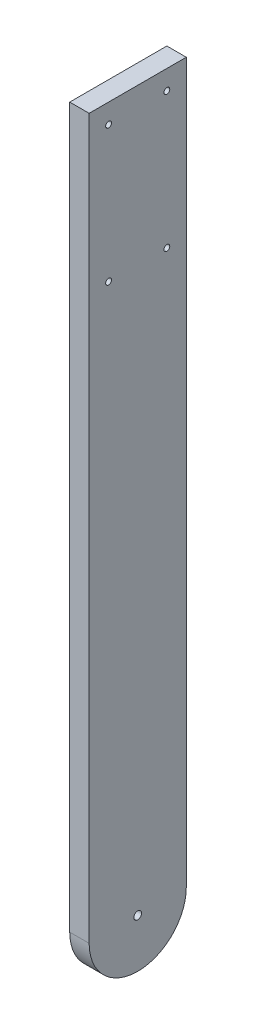
ISO-10303-21;
HEADER;
FILE_DESCRIPTION(('STEP AP214'),'2;1');
FILE_NAME('part.step','',(''),(''),'','','');
FILE_SCHEMA(('AUTOMOTIVE_DESIGN { 1 0 10303 214 1 1 1 1 }'));
ENDSEC;
DATA;
#1=APPLICATION_CONTEXT('core data for automotive mechanical design processes');
#2=APPLICATION_PROTOCOL_DEFINITION('international standard','automotive_design',2000,#1);
#3=PRODUCT_CONTEXT('',#1,'mechanical');
#4=PRODUCT('Part','Part','',(#3));
#5=PRODUCT_RELATED_PRODUCT_CATEGORY('part','',(#4));
#6=PRODUCT_DEFINITION_FORMATION('','',#4);
#7=PRODUCT_DEFINITION_CONTEXT('part definition',#1,'design');
#8=PRODUCT_DEFINITION('design','',#6,#7);
#9=PRODUCT_DEFINITION_SHAPE('','',#8);
#10=(LENGTH_UNIT() NAMED_UNIT(*) SI_UNIT(.MILLI.,.METRE.));
#11=(NAMED_UNIT(*) PLANE_ANGLE_UNIT() SI_UNIT($,.RADIAN.));
#12=(NAMED_UNIT(*) SI_UNIT($,.STERADIAN.) SOLID_ANGLE_UNIT());
#13=UNCERTAINTY_MEASURE_WITH_UNIT(LENGTH_MEASURE(1.E-05),#10,'distance_accuracy_value','');
#14=(GEOMETRIC_REPRESENTATION_CONTEXT(3) GLOBAL_UNCERTAINTY_ASSIGNED_CONTEXT((#13)) GLOBAL_UNIT_ASSIGNED_CONTEXT((#10,
#11,#12)) REPRESENTATION_CONTEXT('',''));
#15=CARTESIAN_POINT('',(0.,0.,0.));
#16=DIRECTION('',(0.,0.,1.));
#17=DIRECTION('',(1.,0.,0.));
#18=AXIS2_PLACEMENT_3D('',#15,#16,#17);
#19=CARTESIAN_POINT('',(5.,100.,-12.5));
#20=DIRECTION('',(0.,0.,1.));
#21=DIRECTION('',(0.,-1.,0.));
#22=AXIS2_PLACEMENT_3D('',#19,#20,#21);
#23=PLANE('',#22);
#24=DIRECTION('',(0.,1.,0.));
#25=VECTOR('',#24,1.);
#26=CARTESIAN_POINT('',(0.,100.,-12.5));
#27=LINE('',#26,#25);
#28=CARTESIAN_POINT('',(0.,-85.,-12.5));
#29=VERTEX_POINT('',#28);
#30=CARTESIAN_POINT('',(0.,100.,-12.5));
#31=VERTEX_POINT('',#30);
#32=EDGE_CURVE('E96',#29,#31,#27,.T.);
#33=ORIENTED_EDGE('',*,*,#32,.T.);
#34=DIRECTION('',(-1.,0.,0.));
#35=VECTOR('',#34,1.);
#36=CARTESIAN_POINT('',(5.,100.,-12.5));
#37=LINE('',#36,#35);
#38=CARTESIAN_POINT('',(5.,100.,-12.5));
#39=VERTEX_POINT('',#38);
#40=EDGE_CURVE('E11',#39,#31,#37,.T.);
#41=ORIENTED_EDGE('',*,*,#40,.F.);
#42=DIRECTION('',(0.,1.,0.));
#43=VECTOR('',#42,1.);
#44=CARTESIAN_POINT('',(5.,100.,-12.5));
#45=LINE('',#44,#43);
#46=CARTESIAN_POINT('',(5.,-85.,-12.5));
#47=VERTEX_POINT('',#46);
#48=EDGE_CURVE('E84',#47,#39,#45,.T.);
#49=ORIENTED_EDGE('',*,*,#48,.F.);
#50=DIRECTION('',(-1.,0.,0.));
#51=VECTOR('',#50,1.);
#52=CARTESIAN_POINT('',(5.,-85.,-12.5));
#53=LINE('',#52,#51);
#54=EDGE_CURVE('E92',#47,#29,#53,.T.);
#55=ORIENTED_EDGE('',*,*,#54,.T.);
#56=EDGE_LOOP('',(#33,#41,#49,#55));
#57=FACE_BOUND('',#56,.T.);
#58=ADVANCED_FACE('F33',(#57),#23,.F.);
#59=CARTESIAN_POINT('',(5.,100.,-12.5));
#60=DIRECTION('',(0.,-1.,0.));
#61=DIRECTION('',(0.,0.,-1.));
#62=AXIS2_PLACEMENT_3D('',#59,#60,#61);
#63=PLANE('',#62);
#64=DIRECTION('',(0.,0.,1.));
#65=VECTOR('',#64,1.);
#66=CARTESIAN_POINT('',(0.,100.,-12.5));
#67=LINE('',#66,#65);
#68=CARTESIAN_POINT('',(0.,100.,12.5));
#69=VERTEX_POINT('',#68);
#70=EDGE_CURVE('E88',#31,#69,#67,.T.);
#71=ORIENTED_EDGE('',*,*,#70,.T.);
#72=DIRECTION('',(-1.,0.,0.));
#73=VECTOR('',#72,1.);
#74=CARTESIAN_POINT('',(5.,100.,12.5));
#75=LINE('',#74,#73);
#76=CARTESIAN_POINT('',(5.,100.,12.5));
#77=VERTEX_POINT('',#76);
#78=EDGE_CURVE('E41',#77,#69,#75,.T.);
#79=ORIENTED_EDGE('',*,*,#78,.F.);
#80=DIRECTION('',(0.,0.,1.));
#81=VECTOR('',#80,1.);
#82=CARTESIAN_POINT('',(5.,100.,-12.5));
#83=LINE('',#82,#81);
#84=EDGE_CURVE('E79',#39,#77,#83,.T.);
#85=ORIENTED_EDGE('',*,*,#84,.F.);
#86=ORIENTED_EDGE('',*,*,#40,.T.);
#87=EDGE_LOOP('',(#71,#79,#85,#86));
#88=FACE_BOUND('',#87,.T.);
#89=ADVANCED_FACE('F87',(#88),#63,.F.);
#90=CARTESIAN_POINT('',(5.,100.,12.5));
#91=DIRECTION('',(0.,0.,-1.));
#92=DIRECTION('',(0.,1.,0.));
#93=AXIS2_PLACEMENT_3D('',#90,#91,#92);
#94=PLANE('',#93);
#95=DIRECTION('',(0.,-1.,0.));
#96=VECTOR('',#95,1.);
#97=CARTESIAN_POINT('',(0.,100.,12.5));
#98=LINE('',#97,#96);
#99=CARTESIAN_POINT('',(0.,-85.,12.5));
#100=VERTEX_POINT('',#99);
#101=EDGE_CURVE('E66',#69,#100,#98,.T.);
#102=ORIENTED_EDGE('',*,*,#101,.T.);
#103=DIRECTION('',(-1.,0.,0.));
#104=VECTOR('',#103,1.);
#105=CARTESIAN_POINT('',(5.,-85.,12.5));
#106=LINE('',#105,#104);
#107=CARTESIAN_POINT('',(5.,-85.,12.5));
#108=VERTEX_POINT('',#107);
#109=EDGE_CURVE('E89',#108,#100,#106,.T.);
#110=ORIENTED_EDGE('',*,*,#109,.F.);
#111=DIRECTION('',(0.,-1.,0.));
#112=VECTOR('',#111,1.);
#113=CARTESIAN_POINT('',(5.,100.,12.5));
#114=LINE('',#113,#112);
#115=EDGE_CURVE('E82',#77,#108,#114,.T.);
#116=ORIENTED_EDGE('',*,*,#115,.F.);
#117=ORIENTED_EDGE('',*,*,#78,.T.);
#118=EDGE_LOOP('',(#102,#110,#116,#117));
#119=FACE_BOUND('',#118,.T.);
#120=ADVANCED_FACE('F90',(#119),#94,.F.);
#121=CARTESIAN_POINT('',(5.,-85.,0.));
#122=DIRECTION('',(-1.,0.,0.));
#123=DIRECTION('',(0.,0.,1.));
#124=AXIS2_PLACEMENT_3D('',#121,#122,#123);
#125=CYLINDRICAL_SURFACE('',#124,12.5);
#126=CARTESIAN_POINT('',(0.,-85.,0.));
#127=DIRECTION('',(1.,0.,0.));
#128=DIRECTION('',(0.,0.,-1.));
#129=AXIS2_PLACEMENT_3D('',#126,#127,#128);
#130=CIRCLE('',#129,12.5);
#131=EDGE_CURVE('E72',#100,#29,#130,.T.);
#132=ORIENTED_EDGE('',*,*,#131,.T.);
#133=ORIENTED_EDGE('',*,*,#54,.F.);
#134=CARTESIAN_POINT('',(5.,-85.,0.));
#135=DIRECTION('',(1.,0.,0.));
#136=DIRECTION('',(0.,0.,-1.));
#137=AXIS2_PLACEMENT_3D('',#134,#135,#136);
#138=CIRCLE('',#137,12.5);
#139=EDGE_CURVE('E49',#108,#47,#138,.T.);
#140=ORIENTED_EDGE('',*,*,#139,.F.);
#141=ORIENTED_EDGE('',*,*,#109,.T.);
#142=EDGE_LOOP('',(#132,#133,#140,#141));
#143=FACE_BOUND('',#142,.T.);
#144=ADVANCED_FACE('F104',(#143),#125,.T.);
#145=CARTESIAN_POINT('',(5.,-85.,0.));
#146=DIRECTION('',(1.,0.,0.));
#147=DIRECTION('',(0.,0.,-1.));
#148=AXIS2_PLACEMENT_3D('',#145,#146,#147);
#149=PLANE('',#148);
#150=CARTESIAN_POINT('',(5.,-85.,0.));
#151=DIRECTION('',(-1.,0.,0.));
#152=DIRECTION('',(0.,0.,1.));
#153=AXIS2_PLACEMENT_3D('',#150,#151,#152);
#154=CIRCLE('',#153,1.);
#155=CARTESIAN_POINT('',(5.,-85.,1.));
#156=VERTEX_POINT('',#155);
#157=EDGE_CURVE('E120',#156,#156,#154,.T.);
#158=ORIENTED_EDGE('',*,*,#157,.T.);
#159=EDGE_LOOP('',(#158));
#160=FACE_BOUND('',#159,.T.);
#161=CARTESIAN_POINT('',(5.,95.,7.5));
#162=DIRECTION('',(-1.,0.,0.));
#163=DIRECTION('',(0.,0.,-1.));
#164=AXIS2_PLACEMENT_3D('',#161,#162,#163);
#165=CIRCLE('',#164,0.75);
#166=CARTESIAN_POINT('',(5.,95.,6.75));
#167=VERTEX_POINT('',#166);
#168=EDGE_CURVE('E119',#167,#167,#165,.T.);
#169=ORIENTED_EDGE('',*,*,#168,.T.);
#170=EDGE_LOOP('',(#169));
#171=FACE_BOUND('',#170,.T.);
#172=CARTESIAN_POINT('',(5.,60.,7.5));
#173=DIRECTION('',(-1.,0.,0.));
#174=DIRECTION('',(0.,0.,1.));
#175=AXIS2_PLACEMENT_3D('',#172,#173,#174);
#176=CIRCLE('',#175,0.75);
#177=CARTESIAN_POINT('',(5.,60.,8.25));
#178=VERTEX_POINT('',#177);
#179=EDGE_CURVE('E126',#178,#178,#176,.T.);
#180=ORIENTED_EDGE('',*,*,#179,.T.);
#181=EDGE_LOOP('',(#180));
#182=FACE_BOUND('',#181,.T.);
#183=CARTESIAN_POINT('',(5.,60.,-7.5));
#184=DIRECTION('',(-1.,0.,0.));
#185=DIRECTION('',(0.,0.,-1.));
#186=AXIS2_PLACEMENT_3D('',#183,#184,#185);
#187=CIRCLE('',#186,0.75);
#188=CARTESIAN_POINT('',(5.,60.,-8.25));
#189=VERTEX_POINT('',#188);
#190=EDGE_CURVE('E113',#189,#189,#187,.T.);
#191=ORIENTED_EDGE('',*,*,#190,.T.);
#192=EDGE_LOOP('',(#191));
#193=FACE_BOUND('',#192,.T.);
#194=CARTESIAN_POINT('',(5.,95.,-7.5));
#195=DIRECTION('',(-1.,0.,0.));
#196=DIRECTION('',(0.,0.,1.));
#197=AXIS2_PLACEMENT_3D('',#194,#195,#196);
#198=CIRCLE('',#197,0.75);
#199=CARTESIAN_POINT('',(5.,95.,-6.75));
#200=VERTEX_POINT('',#199);
#201=EDGE_CURVE('E99',#200,#200,#198,.T.);
#202=ORIENTED_EDGE('',*,*,#201,.T.);
#203=EDGE_LOOP('',(#202));
#204=FACE_BOUND('',#203,.T.);
#205=ORIENTED_EDGE('',*,*,#48,.T.);
#206=ORIENTED_EDGE('',*,*,#84,.T.);
#207=ORIENTED_EDGE('',*,*,#115,.T.);
#208=ORIENTED_EDGE('',*,*,#139,.T.);
#209=EDGE_LOOP('',(#205,#206,#207,#208));
#210=FACE_BOUND('',#209,.T.);
#211=ADVANCED_FACE('F80',(#160,#171,#182,#193,#204,#210),#149,.T.);
#212=CARTESIAN_POINT('',(0.,-85.,0.));
#213=DIRECTION('',(1.,0.,0.));
#214=DIRECTION('',(0.,0.,-1.));
#215=AXIS2_PLACEMENT_3D('',#212,#213,#214);
#216=PLANE('',#215);
#217=CARTESIAN_POINT('',(0.,-85.,0.));
#218=DIRECTION('',(-1.,0.,0.));
#219=DIRECTION('',(0.,0.,1.));
#220=AXIS2_PLACEMENT_3D('',#217,#218,#219);
#221=CIRCLE('',#220,1.);
#222=CARTESIAN_POINT('',(0.,-85.,1.));
#223=VERTEX_POINT('',#222);
#224=EDGE_CURVE('E134',#223,#223,#221,.T.);
#225=ORIENTED_EDGE('',*,*,#224,.F.);
#226=EDGE_LOOP('',(#225));
#227=FACE_BOUND('',#226,.T.);
#228=CARTESIAN_POINT('',(0.,95.,7.5));
#229=DIRECTION('',(-1.,0.,0.));
#230=DIRECTION('',(0.,0.,-1.));
#231=AXIS2_PLACEMENT_3D('',#228,#229,#230);
#232=CIRCLE('',#231,0.75);
#233=CARTESIAN_POINT('',(0.,95.,6.75));
#234=VERTEX_POINT('',#233);
#235=EDGE_CURVE('E116',#234,#234,#232,.T.);
#236=ORIENTED_EDGE('',*,*,#235,.F.);
#237=EDGE_LOOP('',(#236));
#238=FACE_BOUND('',#237,.T.);
#239=CARTESIAN_POINT('',(0.,60.,7.5));
#240=DIRECTION('',(-1.,0.,0.));
#241=DIRECTION('',(0.,0.,1.));
#242=AXIS2_PLACEMENT_3D('',#239,#240,#241);
#243=CIRCLE('',#242,0.75);
#244=CARTESIAN_POINT('',(0.,60.,8.25));
#245=VERTEX_POINT('',#244);
#246=EDGE_CURVE('E123',#245,#245,#243,.T.);
#247=ORIENTED_EDGE('',*,*,#246,.F.);
#248=EDGE_LOOP('',(#247));
#249=FACE_BOUND('',#248,.T.);
#250=CARTESIAN_POINT('',(0.,60.,-7.5));
#251=DIRECTION('',(-1.,0.,0.));
#252=DIRECTION('',(0.,0.,-1.));
#253=AXIS2_PLACEMENT_3D('',#250,#251,#252);
#254=CIRCLE('',#253,0.75);
#255=CARTESIAN_POINT('',(0.,60.,-8.25));
#256=VERTEX_POINT('',#255);
#257=EDGE_CURVE('E129',#256,#256,#254,.T.);
#258=ORIENTED_EDGE('',*,*,#257,.F.);
#259=EDGE_LOOP('',(#258));
#260=FACE_BOUND('',#259,.T.);
#261=CARTESIAN_POINT('',(0.,95.,-7.5));
#262=DIRECTION('',(-1.,0.,0.));
#263=DIRECTION('',(0.,0.,1.));
#264=AXIS2_PLACEMENT_3D('',#261,#262,#263);
#265=CIRCLE('',#264,0.75);
#266=CARTESIAN_POINT('',(0.,95.,-6.75));
#267=VERTEX_POINT('',#266);
#268=EDGE_CURVE('E110',#267,#267,#265,.T.);
#269=ORIENTED_EDGE('',*,*,#268,.F.);
#270=EDGE_LOOP('',(#269));
#271=FACE_BOUND('',#270,.T.);
#272=ORIENTED_EDGE('',*,*,#32,.F.);
#273=ORIENTED_EDGE('',*,*,#131,.F.);
#274=ORIENTED_EDGE('',*,*,#101,.F.);
#275=ORIENTED_EDGE('',*,*,#70,.F.);
#276=EDGE_LOOP('',(#272,#273,#274,#275));
#277=FACE_BOUND('',#276,.T.);
#278=ADVANCED_FACE('F107',(#227,#238,#249,#260,#271,#277),#216,.F.);
#279=CARTESIAN_POINT('',(5.,95.,-7.5));
#280=DIRECTION('',(-1.,0.,0.));
#281=DIRECTION('',(0.,0.,1.));
#282=AXIS2_PLACEMENT_3D('',#279,#280,#281);
#283=CYLINDRICAL_SURFACE('',#282,0.75);
#284=ORIENTED_EDGE('',*,*,#201,.F.);
#285=EDGE_LOOP('',(#284));
#286=FACE_BOUND('',#285,.T.);
#287=ORIENTED_EDGE('',*,*,#268,.T.);
#288=EDGE_LOOP('',(#287));
#289=FACE_BOUND('',#288,.T.);
#290=ADVANCED_FACE('F151',(#286,#289),#283,.F.);
#291=CARTESIAN_POINT('',(5.,60.,-7.5));
#292=DIRECTION('',(-1.,0.,0.));
#293=DIRECTION('',(0.,0.,1.));
#294=AXIS2_PLACEMENT_3D('',#291,#292,#293);
#295=CYLINDRICAL_SURFACE('',#294,0.75);
#296=ORIENTED_EDGE('',*,*,#190,.F.);
#297=EDGE_LOOP('',(#296));
#298=FACE_BOUND('',#297,.T.);
#299=ORIENTED_EDGE('',*,*,#257,.T.);
#300=EDGE_LOOP('',(#299));
#301=FACE_BOUND('',#300,.T.);
#302=ADVANCED_FACE('F162',(#298,#301),#295,.F.);
#303=CARTESIAN_POINT('',(5.,60.,7.5));
#304=DIRECTION('',(-1.,0.,0.));
#305=DIRECTION('',(0.,0.,1.));
#306=AXIS2_PLACEMENT_3D('',#303,#304,#305);
#307=CYLINDRICAL_SURFACE('',#306,0.75);
#308=ORIENTED_EDGE('',*,*,#179,.F.);
#309=EDGE_LOOP('',(#308));
#310=FACE_BOUND('',#309,.T.);
#311=ORIENTED_EDGE('',*,*,#246,.T.);
#312=EDGE_LOOP('',(#311));
#313=FACE_BOUND('',#312,.T.);
#314=ADVANCED_FACE('F168',(#310,#313),#307,.F.);
#315=CARTESIAN_POINT('',(5.,95.,7.5));
#316=DIRECTION('',(-1.,0.,0.));
#317=DIRECTION('',(0.,0.,1.));
#318=AXIS2_PLACEMENT_3D('',#315,#316,#317);
#319=CYLINDRICAL_SURFACE('',#318,0.75);
#320=ORIENTED_EDGE('',*,*,#168,.F.);
#321=EDGE_LOOP('',(#320));
#322=FACE_BOUND('',#321,.T.);
#323=ORIENTED_EDGE('',*,*,#235,.T.);
#324=EDGE_LOOP('',(#323));
#325=FACE_BOUND('',#324,.T.);
#326=ADVANCED_FACE('F145',(#322,#325),#319,.F.);
#327=CARTESIAN_POINT('',(5.,-85.,0.));
#328=DIRECTION('',(-1.,0.,0.));
#329=DIRECTION('',(0.,0.,1.));
#330=AXIS2_PLACEMENT_3D('',#327,#328,#329);
#331=CYLINDRICAL_SURFACE('',#330,1.);
#332=ORIENTED_EDGE('',*,*,#157,.F.);
#333=EDGE_LOOP('',(#332));
#334=FACE_BOUND('',#333,.T.);
#335=ORIENTED_EDGE('',*,*,#224,.T.);
#336=EDGE_LOOP('',(#335));
#337=FACE_BOUND('',#336,.T.);
#338=ADVANCED_FACE('F142',(#334,#337),#331,.F.);
#339=CLOSED_SHELL('',(#58,#89,#120,#144,#211,#278,#290,#302,#314,#326,#338));
#340=MANIFOLD_SOLID_BREP('B2',#339);
#341=ADVANCED_BREP_SHAPE_REPRESENTATION('',(#18,#340),#14);
#342=SHAPE_DEFINITION_REPRESENTATION(#9,#341);
ENDSEC;
END-ISO-10303-21;
